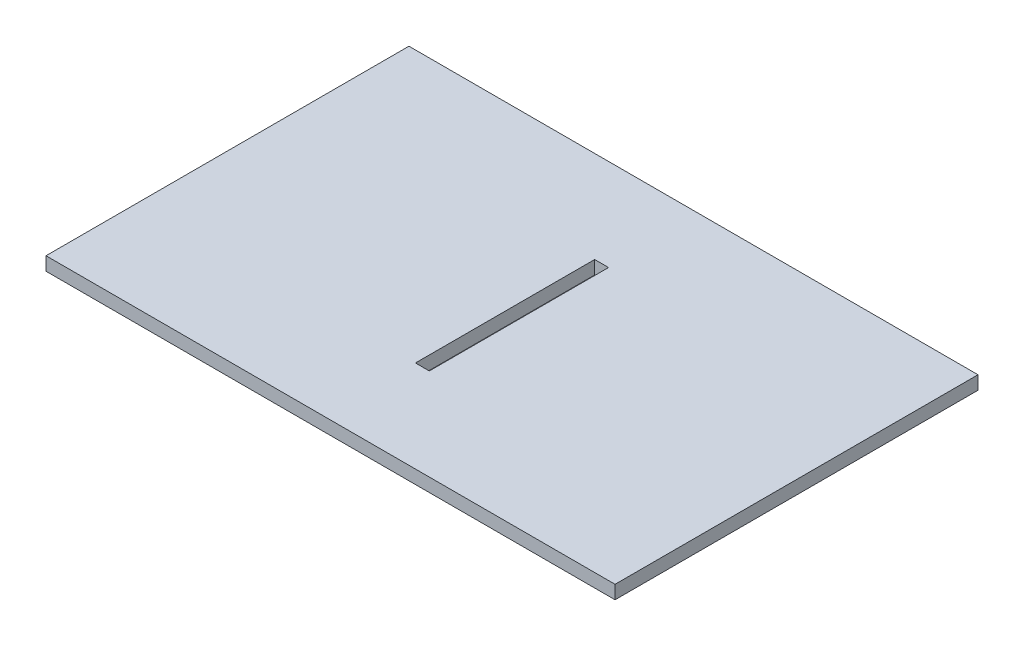
ISO-10303-21;
HEADER;
FILE_DESCRIPTION(('STEP AP214'),'2;1');
FILE_NAME('part.step','',(''),(''),'','','');
FILE_SCHEMA(('AUTOMOTIVE_DESIGN { 1 0 10303 214 1 1 1 1 }'));
ENDSEC;
DATA;
#1=APPLICATION_CONTEXT('core data for automotive mechanical design processes');
#2=APPLICATION_PROTOCOL_DEFINITION('international standard','automotive_design',2000,#1);
#3=PRODUCT_CONTEXT('',#1,'mechanical');
#4=PRODUCT('Part','Part','',(#3));
#5=PRODUCT_RELATED_PRODUCT_CATEGORY('part','',(#4));
#6=PRODUCT_DEFINITION_FORMATION('','',#4);
#7=PRODUCT_DEFINITION_CONTEXT('part definition',#1,'design');
#8=PRODUCT_DEFINITION('design','',#6,#7);
#9=PRODUCT_DEFINITION_SHAPE('','',#8);
#10=(LENGTH_UNIT() NAMED_UNIT(*) SI_UNIT(.MILLI.,.METRE.));
#11=(NAMED_UNIT(*) PLANE_ANGLE_UNIT() SI_UNIT($,.RADIAN.));
#12=(NAMED_UNIT(*) SI_UNIT($,.STERADIAN.) SOLID_ANGLE_UNIT());
#13=UNCERTAINTY_MEASURE_WITH_UNIT(LENGTH_MEASURE(1.E-05),#10,'distance_accuracy_value','');
#14=(GEOMETRIC_REPRESENTATION_CONTEXT(3) GLOBAL_UNCERTAINTY_ASSIGNED_CONTEXT((#13)) GLOBAL_UNIT_ASSIGNED_CONTEXT((#10,
#11,#12)) REPRESENTATION_CONTEXT('',''));
#15=CARTESIAN_POINT('',(0.,0.,0.));
#16=DIRECTION('',(0.,0.,1.));
#17=DIRECTION('',(1.,0.,0.));
#18=AXIS2_PLACEMENT_3D('',#15,#16,#17);
#19=CARTESIAN_POINT('',(0.,1.5,0.));
#20=DIRECTION('',(0.,-1.,0.));
#21=DIRECTION('',(0.,0.,-1.));
#22=AXIS2_PLACEMENT_3D('',#19,#20,#21);
#23=PLANE('',#22);
#24=DIRECTION('',(0.,0.,-1.));
#25=VECTOR('',#24,1.);
#26=CARTESIAN_POINT('',(31.75,1.5,20.25));
#27=LINE('',#26,#25);
#28=CARTESIAN_POINT('',(31.75,1.5,20.25));
#29=VERTEX_POINT('',#28);
#30=CARTESIAN_POINT('',(31.75,1.5,-20.25));
#31=VERTEX_POINT('',#30);
#32=EDGE_CURVE('E137',#29,#31,#27,.T.);
#33=ORIENTED_EDGE('',*,*,#32,.T.);
#34=DIRECTION('',(-1.,0.,0.));
#35=VECTOR('',#34,1.);
#36=CARTESIAN_POINT('',(-31.75,1.5,-20.25));
#37=LINE('',#36,#35);
#38=CARTESIAN_POINT('',(-31.75,1.5,-20.25));
#39=VERTEX_POINT('',#38);
#40=EDGE_CURVE('E140',#31,#39,#37,.T.);
#41=ORIENTED_EDGE('',*,*,#40,.T.);
#42=DIRECTION('',(0.,0.,1.));
#43=VECTOR('',#42,1.);
#44=CARTESIAN_POINT('',(-31.75,1.5,20.25));
#45=LINE('',#44,#43);
#46=CARTESIAN_POINT('',(-31.75,1.5,20.25));
#47=VERTEX_POINT('',#46);
#48=EDGE_CURVE('E143',#39,#47,#45,.T.);
#49=ORIENTED_EDGE('',*,*,#48,.T.);
#50=DIRECTION('',(1.,0.,0.));
#51=VECTOR('',#50,1.);
#52=CARTESIAN_POINT('',(-31.75,1.5,20.25));
#53=LINE('',#52,#51);
#54=EDGE_CURVE('E145',#47,#29,#53,.T.);
#55=ORIENTED_EDGE('',*,*,#54,.T.);
#56=EDGE_LOOP('',(#33,#41,#49,#55));
#57=FACE_BOUND('',#56,.T.);
#58=DIRECTION('',(0.,0.,-1.));
#59=VECTOR('',#58,1.);
#60=CARTESIAN_POINT('',(0.775,1.5,10.));
#61=LINE('',#60,#59);
#62=CARTESIAN_POINT('',(0.775,1.5,10.));
#63=VERTEX_POINT('',#62);
#64=CARTESIAN_POINT('',(0.775,1.5,-10.));
#65=VERTEX_POINT('',#64);
#66=EDGE_CURVE('E101',#63,#65,#61,.T.);
#67=ORIENTED_EDGE('',*,*,#66,.F.);
#68=DIRECTION('',(1.,0.,0.));
#69=VECTOR('',#68,1.);
#70=CARTESIAN_POINT('',(-0.775,1.5,10.));
#71=LINE('',#70,#69);
#72=CARTESIAN_POINT('',(-0.775,1.5,10.));
#73=VERTEX_POINT('',#72);
#74=EDGE_CURVE('E123',#73,#63,#71,.T.);
#75=ORIENTED_EDGE('',*,*,#74,.F.);
#76=DIRECTION('',(0.,0.,1.));
#77=VECTOR('',#76,1.);
#78=CARTESIAN_POINT('',(-0.775,1.5,10.));
#79=LINE('',#78,#77);
#80=CARTESIAN_POINT('',(-0.775,1.5,-10.));
#81=VERTEX_POINT('',#80);
#82=EDGE_CURVE('E121',#81,#73,#79,.T.);
#83=ORIENTED_EDGE('',*,*,#82,.F.);
#84=DIRECTION('',(-1.,0.,0.));
#85=VECTOR('',#84,1.);
#86=CARTESIAN_POINT('',(-0.775,1.5,-10.));
#87=LINE('',#86,#85);
#88=EDGE_CURVE('E109',#65,#81,#87,.T.);
#89=ORIENTED_EDGE('',*,*,#88,.F.);
#90=EDGE_LOOP('',(#67,#75,#83,#89));
#91=FACE_BOUND('',#90,.T.);
#92=ADVANCED_FACE('F36',(#57,#91),#23,.F.);
#93=CARTESIAN_POINT('',(0.,0.,0.));
#94=DIRECTION('',(0.,-1.,0.));
#95=DIRECTION('',(0.,0.,-1.));
#96=AXIS2_PLACEMENT_3D('',#93,#94,#95);
#97=PLANE('',#96);
#98=DIRECTION('',(0.,0.,-1.));
#99=VECTOR('',#98,1.);
#100=CARTESIAN_POINT('',(31.75,0.,20.25));
#101=LINE('',#100,#99);
#102=CARTESIAN_POINT('',(31.75,0.,20.25));
#103=VERTEX_POINT('',#102);
#104=CARTESIAN_POINT('',(31.75,0.,-20.25));
#105=VERTEX_POINT('',#104);
#106=EDGE_CURVE('E117',#103,#105,#101,.T.);
#107=ORIENTED_EDGE('',*,*,#106,.F.);
#108=DIRECTION('',(1.,0.,0.));
#109=VECTOR('',#108,1.);
#110=CARTESIAN_POINT('',(-31.75,0.,20.25));
#111=LINE('',#110,#109);
#112=CARTESIAN_POINT('',(-31.75,0.,20.25));
#113=VERTEX_POINT('',#112);
#114=EDGE_CURVE('E141',#113,#103,#111,.T.);
#115=ORIENTED_EDGE('',*,*,#114,.F.);
#116=DIRECTION('',(0.,0.,1.));
#117=VECTOR('',#116,1.);
#118=CARTESIAN_POINT('',(-31.75,0.,20.25));
#119=LINE('',#118,#117);
#120=CARTESIAN_POINT('',(-31.75,0.,-20.25));
#121=VERTEX_POINT('',#120);
#122=EDGE_CURVE('E152',#121,#113,#119,.T.);
#123=ORIENTED_EDGE('',*,*,#122,.F.);
#124=DIRECTION('',(-1.,0.,0.));
#125=VECTOR('',#124,1.);
#126=CARTESIAN_POINT('',(-31.75,0.,-20.25));
#127=LINE('',#126,#125);
#128=EDGE_CURVE('E150',#105,#121,#127,.T.);
#129=ORIENTED_EDGE('',*,*,#128,.F.);
#130=EDGE_LOOP('',(#107,#115,#123,#129));
#131=FACE_BOUND('',#130,.T.);
#132=DIRECTION('',(1.,0.,0.));
#133=VECTOR('',#132,1.);
#134=CARTESIAN_POINT('',(-0.775,0.,10.));
#135=LINE('',#134,#133);
#136=CARTESIAN_POINT('',(-0.775,0.,10.));
#137=VERTEX_POINT('',#136);
#138=CARTESIAN_POINT('',(0.775,0.,10.));
#139=VERTEX_POINT('',#138);
#140=EDGE_CURVE('E110',#137,#139,#135,.T.);
#141=ORIENTED_EDGE('',*,*,#140,.T.);
#142=DIRECTION('',(0.,0.,-1.));
#143=VECTOR('',#142,1.);
#144=CARTESIAN_POINT('',(0.775,0.,10.));
#145=LINE('',#144,#143);
#146=CARTESIAN_POINT('',(0.775,0.,-10.));
#147=VERTEX_POINT('',#146);
#148=EDGE_CURVE('E59',#139,#147,#145,.T.);
#149=ORIENTED_EDGE('',*,*,#148,.T.);
#150=DIRECTION('',(-1.,0.,0.));
#151=VECTOR('',#150,1.);
#152=CARTESIAN_POINT('',(-0.775,0.,-10.));
#153=LINE('',#152,#151);
#154=CARTESIAN_POINT('',(-0.775,0.,-10.));
#155=VERTEX_POINT('',#154);
#156=EDGE_CURVE('E116',#147,#155,#153,.T.);
#157=ORIENTED_EDGE('',*,*,#156,.T.);
#158=DIRECTION('',(0.,0.,1.));
#159=VECTOR('',#158,1.);
#160=CARTESIAN_POINT('',(-0.775,0.,10.));
#161=LINE('',#160,#159);
#162=EDGE_CURVE('E129',#155,#137,#161,.T.);
#163=ORIENTED_EDGE('',*,*,#162,.T.);
#164=EDGE_LOOP('',(#141,#149,#157,#163));
#165=FACE_BOUND('',#164,.T.);
#166=ADVANCED_FACE('F170',(#131,#165),#97,.T.);
#167=CARTESIAN_POINT('',(31.75,1.5,20.25));
#168=DIRECTION('',(-1.,0.,0.));
#169=DIRECTION('',(0.,0.,1.));
#170=AXIS2_PLACEMENT_3D('',#167,#168,#169);
#171=PLANE('',#170);
#172=ORIENTED_EDGE('',*,*,#106,.T.);
#173=DIRECTION('',(0.,-1.,0.));
#174=VECTOR('',#173,1.);
#175=CARTESIAN_POINT('',(31.75,1.5,-20.25));
#176=LINE('',#175,#174);
#177=EDGE_CURVE('E11',#31,#105,#176,.T.);
#178=ORIENTED_EDGE('',*,*,#177,.F.);
#179=ORIENTED_EDGE('',*,*,#32,.F.);
#180=DIRECTION('',(0.,-1.,0.));
#181=VECTOR('',#180,1.);
#182=CARTESIAN_POINT('',(31.75,1.5,20.25));
#183=LINE('',#182,#181);
#184=EDGE_CURVE('E147',#29,#103,#183,.T.);
#185=ORIENTED_EDGE('',*,*,#184,.T.);
#186=EDGE_LOOP('',(#172,#178,#179,#185));
#187=FACE_BOUND('',#186,.T.);
#188=ADVANCED_FACE('F38',(#187),#171,.F.);
#189=CARTESIAN_POINT('',(-31.75,1.5,-20.25));
#190=DIRECTION('',(0.,0.,1.));
#191=DIRECTION('',(1.,0.,0.));
#192=AXIS2_PLACEMENT_3D('',#189,#190,#191);
#193=PLANE('',#192);
#194=ORIENTED_EDGE('',*,*,#128,.T.);
#195=DIRECTION('',(0.,-1.,0.));
#196=VECTOR('',#195,1.);
#197=CARTESIAN_POINT('',(-31.75,1.5,-20.25));
#198=LINE('',#197,#196);
#199=EDGE_CURVE('E44',#39,#121,#198,.T.);
#200=ORIENTED_EDGE('',*,*,#199,.F.);
#201=ORIENTED_EDGE('',*,*,#40,.F.);
#202=ORIENTED_EDGE('',*,*,#177,.T.);
#203=EDGE_LOOP('',(#194,#200,#201,#202));
#204=FACE_BOUND('',#203,.T.);
#205=ADVANCED_FACE('F180',(#204),#193,.F.);
#206=CARTESIAN_POINT('',(-31.75,1.5,20.25));
#207=DIRECTION('',(1.,0.,0.));
#208=DIRECTION('',(0.,0.,-1.));
#209=AXIS2_PLACEMENT_3D('',#206,#207,#208);
#210=PLANE('',#209);
#211=ORIENTED_EDGE('',*,*,#122,.T.);
#212=DIRECTION('',(0.,-1.,0.));
#213=VECTOR('',#212,1.);
#214=CARTESIAN_POINT('',(-31.75,1.5,20.25));
#215=LINE('',#214,#213);
#216=EDGE_CURVE('E157',#47,#113,#215,.T.);
#217=ORIENTED_EDGE('',*,*,#216,.F.);
#218=ORIENTED_EDGE('',*,*,#48,.F.);
#219=ORIENTED_EDGE('',*,*,#199,.T.);
#220=EDGE_LOOP('',(#211,#217,#218,#219));
#221=FACE_BOUND('',#220,.T.);
#222=ADVANCED_FACE('F164',(#221),#210,.F.);
#223=CARTESIAN_POINT('',(-31.75,1.5,20.25));
#224=DIRECTION('',(0.,0.,-1.));
#225=DIRECTION('',(-1.,0.,0.));
#226=AXIS2_PLACEMENT_3D('',#223,#224,#225);
#227=PLANE('',#226);
#228=ORIENTED_EDGE('',*,*,#114,.T.);
#229=ORIENTED_EDGE('',*,*,#184,.F.);
#230=ORIENTED_EDGE('',*,*,#54,.F.);
#231=ORIENTED_EDGE('',*,*,#216,.T.);
#232=EDGE_LOOP('',(#228,#229,#230,#231));
#233=FACE_BOUND('',#232,.T.);
#234=ADVANCED_FACE('F174',(#233),#227,.F.);
#235=CARTESIAN_POINT('',(0.775,1.5,10.));
#236=DIRECTION('',(-1.,0.,0.));
#237=DIRECTION('',(0.,0.,1.));
#238=AXIS2_PLACEMENT_3D('',#235,#236,#237);
#239=PLANE('',#238);
#240=ORIENTED_EDGE('',*,*,#148,.F.);
#241=DIRECTION('',(0.,-1.,0.));
#242=VECTOR('',#241,1.);
#243=CARTESIAN_POINT('',(0.775,1.5,10.));
#244=LINE('',#243,#242);
#245=EDGE_CURVE('E105',#63,#139,#244,.T.);
#246=ORIENTED_EDGE('',*,*,#245,.F.);
#247=ORIENTED_EDGE('',*,*,#66,.T.);
#248=DIRECTION('',(0.,-1.,0.));
#249=VECTOR('',#248,1.);
#250=CARTESIAN_POINT('',(0.775,1.5,-10.));
#251=LINE('',#250,#249);
#252=EDGE_CURVE('E104',#65,#147,#251,.T.);
#253=ORIENTED_EDGE('',*,*,#252,.T.);
#254=EDGE_LOOP('',(#240,#246,#247,#253));
#255=FACE_BOUND('',#254,.T.);
#256=ADVANCED_FACE('F103',(#255),#239,.T.);
#257=CARTESIAN_POINT('',(-0.775,1.5,-10.));
#258=DIRECTION('',(0.,0.,1.));
#259=DIRECTION('',(1.,0.,0.));
#260=AXIS2_PLACEMENT_3D('',#257,#258,#259);
#261=PLANE('',#260);
#262=ORIENTED_EDGE('',*,*,#156,.F.);
#263=ORIENTED_EDGE('',*,*,#252,.F.);
#264=ORIENTED_EDGE('',*,*,#88,.T.);
#265=DIRECTION('',(0.,-1.,0.));
#266=VECTOR('',#265,1.);
#267=CARTESIAN_POINT('',(-0.775,1.5,-10.));
#268=LINE('',#267,#266);
#269=EDGE_CURVE('E118',#81,#155,#268,.T.);
#270=ORIENTED_EDGE('',*,*,#269,.T.);
#271=EDGE_LOOP('',(#262,#263,#264,#270));
#272=FACE_BOUND('',#271,.T.);
#273=ADVANCED_FACE('F113',(#272),#261,.T.);
#274=CARTESIAN_POINT('',(-0.775,1.5,10.));
#275=DIRECTION('',(1.,0.,0.));
#276=DIRECTION('',(0.,0.,-1.));
#277=AXIS2_PLACEMENT_3D('',#274,#275,#276);
#278=PLANE('',#277);
#279=ORIENTED_EDGE('',*,*,#162,.F.);
#280=ORIENTED_EDGE('',*,*,#269,.F.);
#281=ORIENTED_EDGE('',*,*,#82,.T.);
#282=DIRECTION('',(0.,-1.,0.));
#283=VECTOR('',#282,1.);
#284=CARTESIAN_POINT('',(-0.775,1.5,10.));
#285=LINE('',#284,#283);
#286=EDGE_CURVE('E51',#73,#137,#285,.T.);
#287=ORIENTED_EDGE('',*,*,#286,.T.);
#288=EDGE_LOOP('',(#279,#280,#281,#287));
#289=FACE_BOUND('',#288,.T.);
#290=ADVANCED_FACE('F203',(#289),#278,.T.);
#291=CARTESIAN_POINT('',(-0.775,1.5,10.));
#292=DIRECTION('',(0.,0.,-1.));
#293=DIRECTION('',(-1.,0.,0.));
#294=AXIS2_PLACEMENT_3D('',#291,#292,#293);
#295=PLANE('',#294);
#296=ORIENTED_EDGE('',*,*,#140,.F.);
#297=ORIENTED_EDGE('',*,*,#286,.F.);
#298=ORIENTED_EDGE('',*,*,#74,.T.);
#299=ORIENTED_EDGE('',*,*,#245,.T.);
#300=EDGE_LOOP('',(#296,#297,#298,#299));
#301=FACE_BOUND('',#300,.T.);
#302=ADVANCED_FACE('F207',(#301),#295,.T.);
#303=CLOSED_SHELL('',(#92,#166,#188,#205,#222,#234,#256,#273,#290,#302));
#304=MANIFOLD_SOLID_BREP('B2',#303);
#305=ADVANCED_BREP_SHAPE_REPRESENTATION('',(#18,#304),#14);
#306=SHAPE_DEFINITION_REPRESENTATION(#9,#305);
ENDSEC;
END-ISO-10303-21;
